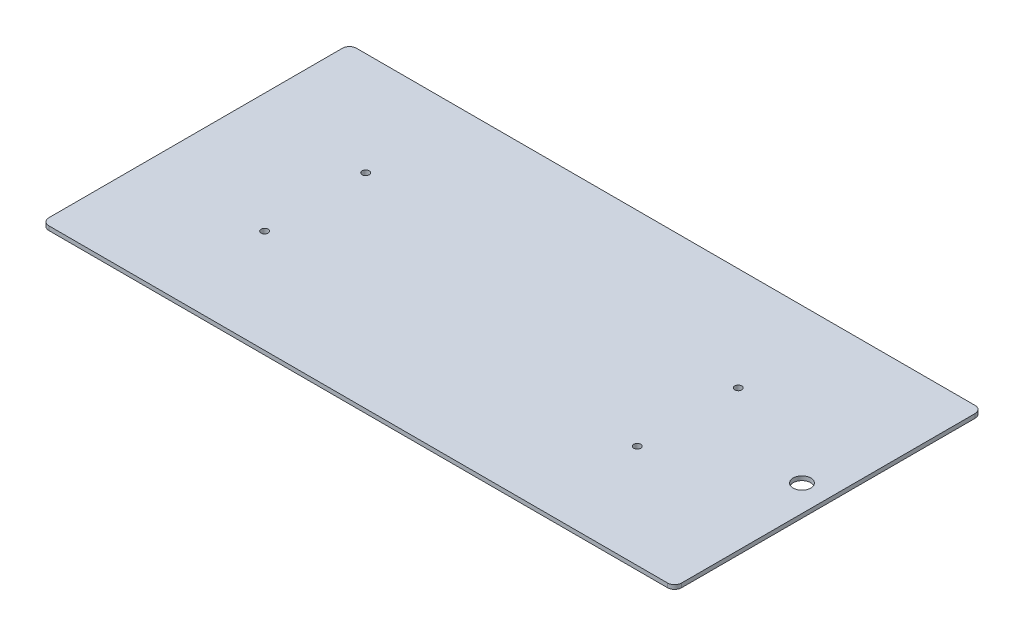
ISO-10303-21;
HEADER;
FILE_DESCRIPTION(('STEP AP214'),'2;1');
FILE_NAME('part.step','',(''),(''),'','','');
FILE_SCHEMA(('AUTOMOTIVE_DESIGN { 1 0 10303 214 1 1 1 1 }'));
ENDSEC;
DATA;
#1=APPLICATION_CONTEXT('core data for automotive mechanical design processes');
#2=APPLICATION_PROTOCOL_DEFINITION('international standard','automotive_design',2000,#1);
#3=PRODUCT_CONTEXT('',#1,'mechanical');
#4=PRODUCT('Part','Part','',(#3));
#5=PRODUCT_RELATED_PRODUCT_CATEGORY('part','',(#4));
#6=PRODUCT_DEFINITION_FORMATION('','',#4);
#7=PRODUCT_DEFINITION_CONTEXT('part definition',#1,'design');
#8=PRODUCT_DEFINITION('design','',#6,#7);
#9=PRODUCT_DEFINITION_SHAPE('','',#8);
#10=(LENGTH_UNIT() NAMED_UNIT(*) SI_UNIT(.MILLI.,.METRE.));
#11=(NAMED_UNIT(*) PLANE_ANGLE_UNIT() SI_UNIT($,.RADIAN.));
#12=(NAMED_UNIT(*) SI_UNIT($,.STERADIAN.) SOLID_ANGLE_UNIT());
#13=UNCERTAINTY_MEASURE_WITH_UNIT(LENGTH_MEASURE(1.E-05),#10,'distance_accuracy_value','');
#14=(GEOMETRIC_REPRESENTATION_CONTEXT(3) GLOBAL_UNCERTAINTY_ASSIGNED_CONTEXT((#13)) GLOBAL_UNIT_ASSIGNED_CONTEXT((#10,
#11,#12)) REPRESENTATION_CONTEXT('',''));
#15=CARTESIAN_POINT('',(0.,0.,0.));
#16=DIRECTION('',(0.,0.,1.));
#17=DIRECTION('',(1.,0.,0.));
#18=AXIS2_PLACEMENT_3D('',#15,#16,#17);
#19=CARTESIAN_POINT('',(223.52,0.,-106.045));
#20=DIRECTION('',(0.,-1.,0.));
#21=DIRECTION('',(0.,0.,-1.));
#22=AXIS2_PLACEMENT_3D('',#19,#20,#21);
#23=PLANE('',#22);
#24=CARTESIAN_POINT('',(-142.24,0.,-36.5125));
#25=DIRECTION('',(0.,-1.,0.));
#26=DIRECTION('',(0.,0.,-1.));
#27=AXIS2_PLACEMENT_3D('',#24,#25,#26);
#28=CIRCLE('',#27,6.09599999999999);
#29=CARTESIAN_POINT('',(-142.24,0.,-42.6085));
#30=VERTEX_POINT('',#29);
#31=EDGE_CURVE('E226',#30,#30,#28,.T.);
#32=ORIENTED_EDGE('',*,*,#31,.F.);
#33=EDGE_LOOP('',(#32));
#34=FACE_BOUND('',#33,.T.);
#35=CARTESIAN_POINT('',(127.,0.,36.5125));
#36=DIRECTION('',(0.,-1.,0.));
#37=DIRECTION('',(0.,0.,-1.));
#38=AXIS2_PLACEMENT_3D('',#35,#36,#37);
#39=CIRCLE('',#38,6.09599999999999);
#40=CARTESIAN_POINT('',(127.,0.,30.4165));
#41=VERTEX_POINT('',#40);
#42=EDGE_CURVE('E207',#41,#41,#39,.T.);
#43=ORIENTED_EDGE('',*,*,#42,.F.);
#44=EDGE_LOOP('',(#43));
#45=FACE_BOUND('',#44,.T.);
#46=CARTESIAN_POINT('',(223.52,0.,-106.045));
#47=DIRECTION('',(0.,1.,0.));
#48=DIRECTION('',(0.,0.,-1.));
#49=AXIS2_PLACEMENT_3D('',#46,#47,#48);
#50=CIRCLE('',#49,5.08);
#51=CARTESIAN_POINT('',(228.6,0.,-106.045));
#52=VERTEX_POINT('',#51);
#53=CARTESIAN_POINT('',(223.52,0.,-111.125));
#54=VERTEX_POINT('',#53);
#55=EDGE_CURVE('E139',#52,#54,#50,.T.);
#56=ORIENTED_EDGE('',*,*,#55,.F.);
#57=DIRECTION('',(0.,0.,-1.));
#58=VECTOR('',#57,1.);
#59=CARTESIAN_POINT('',(228.6,0.,106.045));
#60=LINE('',#59,#58);
#61=CARTESIAN_POINT('',(228.6,0.,106.045));
#62=VERTEX_POINT('',#61);
#63=EDGE_CURVE('E91',#62,#52,#60,.T.);
#64=ORIENTED_EDGE('',*,*,#63,.F.);
#65=CARTESIAN_POINT('',(223.52,0.,106.045));
#66=DIRECTION('',(0.,1.,0.));
#67=DIRECTION('',(0.,0.,1.));
#68=AXIS2_PLACEMENT_3D('',#65,#66,#67);
#69=CIRCLE('',#68,5.08);
#70=CARTESIAN_POINT('',(223.52,0.,111.125));
#71=VERTEX_POINT('',#70);
#72=EDGE_CURVE('E85',#71,#62,#69,.T.);
#73=ORIENTED_EDGE('',*,*,#72,.F.);
#74=DIRECTION('',(1.,0.,0.));
#75=VECTOR('',#74,1.);
#76=CARTESIAN_POINT('',(-223.52,0.,111.125));
#77=LINE('',#76,#75);
#78=CARTESIAN_POINT('',(-223.52,0.,111.125));
#79=VERTEX_POINT('',#78);
#80=EDGE_CURVE('E128',#79,#71,#77,.T.);
#81=ORIENTED_EDGE('',*,*,#80,.F.);
#82=CARTESIAN_POINT('',(-223.52,0.,106.045));
#83=DIRECTION('',(0.,1.,0.));
#84=DIRECTION('',(0.,0.,-1.));
#85=AXIS2_PLACEMENT_3D('',#82,#83,#84);
#86=CIRCLE('',#85,5.08);
#87=CARTESIAN_POINT('',(-228.6,0.,106.045));
#88=VERTEX_POINT('',#87);
#89=EDGE_CURVE('E149',#88,#79,#86,.T.);
#90=ORIENTED_EDGE('',*,*,#89,.F.);
#91=DIRECTION('',(0.,0.,1.));
#92=VECTOR('',#91,1.);
#93=CARTESIAN_POINT('',(-228.6,0.,106.045));
#94=LINE('',#93,#92);
#95=CARTESIAN_POINT('',(-228.6,0.,-106.045));
#96=VERTEX_POINT('',#95);
#97=EDGE_CURVE('E147',#96,#88,#94,.T.);
#98=ORIENTED_EDGE('',*,*,#97,.F.);
#99=CARTESIAN_POINT('',(-223.52,0.,-106.045));
#100=DIRECTION('',(0.,1.,0.));
#101=DIRECTION('',(0.,0.,-1.));
#102=AXIS2_PLACEMENT_3D('',#99,#100,#101);
#103=CIRCLE('',#102,5.08);
#104=CARTESIAN_POINT('',(-223.52,0.,-111.125));
#105=VERTEX_POINT('',#104);
#106=EDGE_CURVE('E145',#105,#96,#103,.T.);
#107=ORIENTED_EDGE('',*,*,#106,.F.);
#108=DIRECTION('',(-1.,0.,0.));
#109=VECTOR('',#108,1.);
#110=CARTESIAN_POINT('',(-223.52,0.,-111.125));
#111=LINE('',#110,#109);
#112=EDGE_CURVE('E142',#54,#105,#111,.T.);
#113=ORIENTED_EDGE('',*,*,#112,.F.);
#114=EDGE_LOOP('',(#56,#64,#73,#81,#90,#98,#107,#113));
#115=FACE_BOUND('',#114,.T.);
#116=CARTESIAN_POINT('',(209.55,0.,0.));
#117=DIRECTION('',(0.,1.,0.));
#118=DIRECTION('',(0.,0.,1.));
#119=AXIS2_PLACEMENT_3D('',#116,#117,#118);
#120=CIRCLE('',#119,6.35);
#121=CARTESIAN_POINT('',(209.55,0.,6.35));
#122=VERTEX_POINT('',#121);
#123=EDGE_CURVE('E201',#122,#122,#120,.T.);
#124=ORIENTED_EDGE('',*,*,#123,.T.);
#125=EDGE_LOOP('',(#124));
#126=FACE_BOUND('',#125,.T.);
#127=CARTESIAN_POINT('',(127.,0.,-36.5125));
#128=DIRECTION('',(0.,-1.,0.));
#129=DIRECTION('',(0.,0.,-1.));
#130=AXIS2_PLACEMENT_3D('',#127,#128,#129);
#131=CIRCLE('',#130,6.09599999999999);
#132=CARTESIAN_POINT('',(127.,0.,-42.6085));
#133=VERTEX_POINT('',#132);
#134=EDGE_CURVE('E217',#133,#133,#131,.T.);
#135=ORIENTED_EDGE('',*,*,#134,.F.);
#136=EDGE_LOOP('',(#135));
#137=FACE_BOUND('',#136,.T.);
#138=CARTESIAN_POINT('',(-142.24,0.,36.5125));
#139=DIRECTION('',(0.,-1.,0.));
#140=DIRECTION('',(0.,0.,-1.));
#141=AXIS2_PLACEMENT_3D('',#138,#139,#140);
#142=CIRCLE('',#141,6.09599999999999);
#143=CARTESIAN_POINT('',(-142.24,0.,30.4165));
#144=VERTEX_POINT('',#143);
#145=EDGE_CURVE('E235',#144,#144,#142,.T.);
#146=ORIENTED_EDGE('',*,*,#145,.F.);
#147=EDGE_LOOP('',(#146));
#148=FACE_BOUND('',#147,.T.);
#149=ADVANCED_FACE('F39',(#34,#45,#115,#126,#137,#148),#23,.T.);
#150=CARTESIAN_POINT('',(223.52,3.,-106.045));
#151=DIRECTION('',(0.,-1.,0.));
#152=DIRECTION('',(0.,0.,-1.));
#153=AXIS2_PLACEMENT_3D('',#150,#151,#152);
#154=PLANE('',#153);
#155=CARTESIAN_POINT('',(223.52,3.,-106.045));
#156=DIRECTION('',(0.,1.,0.));
#157=DIRECTION('',(0.,0.,-1.));
#158=AXIS2_PLACEMENT_3D('',#155,#156,#157);
#159=CIRCLE('',#158,5.08);
#160=CARTESIAN_POINT('',(228.6,3.,-106.045));
#161=VERTEX_POINT('',#160);
#162=CARTESIAN_POINT('',(223.52,3.,-111.125));
#163=VERTEX_POINT('',#162);
#164=EDGE_CURVE('E154',#161,#163,#159,.T.);
#165=ORIENTED_EDGE('',*,*,#164,.T.);
#166=DIRECTION('',(-1.,0.,0.));
#167=VECTOR('',#166,1.);
#168=CARTESIAN_POINT('',(-223.52,3.,-111.125));
#169=LINE('',#168,#167);
#170=CARTESIAN_POINT('',(-223.52,3.,-111.125));
#171=VERTEX_POINT('',#170);
#172=EDGE_CURVE('E99',#163,#171,#169,.T.);
#173=ORIENTED_EDGE('',*,*,#172,.T.);
#174=CARTESIAN_POINT('',(-223.52,3.,-106.045));
#175=DIRECTION('',(0.,1.,0.));
#176=DIRECTION('',(0.,0.,-1.));
#177=AXIS2_PLACEMENT_3D('',#174,#175,#176);
#178=CIRCLE('',#177,5.08);
#179=CARTESIAN_POINT('',(-228.6,3.,-106.045));
#180=VERTEX_POINT('',#179);
#181=EDGE_CURVE('E169',#171,#180,#178,.T.);
#182=ORIENTED_EDGE('',*,*,#181,.T.);
#183=DIRECTION('',(0.,0.,1.));
#184=VECTOR('',#183,1.);
#185=CARTESIAN_POINT('',(-228.6,3.,106.045));
#186=LINE('',#185,#184);
#187=CARTESIAN_POINT('',(-228.6,3.,106.045));
#188=VERTEX_POINT('',#187);
#189=EDGE_CURVE('E181',#180,#188,#186,.T.);
#190=ORIENTED_EDGE('',*,*,#189,.T.);
#191=CARTESIAN_POINT('',(-223.52,3.,106.045));
#192=DIRECTION('',(0.,1.,0.));
#193=DIRECTION('',(0.,0.,-1.));
#194=AXIS2_PLACEMENT_3D('',#191,#192,#193);
#195=CIRCLE('',#194,5.08);
#196=CARTESIAN_POINT('',(-223.52,3.,111.125));
#197=VERTEX_POINT('',#196);
#198=EDGE_CURVE('E119',#188,#197,#195,.T.);
#199=ORIENTED_EDGE('',*,*,#198,.T.);
#200=DIRECTION('',(1.,0.,0.));
#201=VECTOR('',#200,1.);
#202=CARTESIAN_POINT('',(-223.52,3.,111.125));
#203=LINE('',#202,#201);
#204=CARTESIAN_POINT('',(223.52,3.,111.125));
#205=VERTEX_POINT('',#204);
#206=EDGE_CURVE('E112',#197,#205,#203,.T.);
#207=ORIENTED_EDGE('',*,*,#206,.T.);
#208=CARTESIAN_POINT('',(223.52,3.,106.045));
#209=DIRECTION('',(0.,1.,0.));
#210=DIRECTION('',(0.,0.,1.));
#211=AXIS2_PLACEMENT_3D('',#208,#209,#210);
#212=CIRCLE('',#211,5.08);
#213=CARTESIAN_POINT('',(228.6,3.,106.045));
#214=VERTEX_POINT('',#213);
#215=EDGE_CURVE('E117',#205,#214,#212,.T.);
#216=ORIENTED_EDGE('',*,*,#215,.T.);
#217=DIRECTION('',(0.,0.,-1.));
#218=VECTOR('',#217,1.);
#219=CARTESIAN_POINT('',(228.6,3.,106.045));
#220=LINE('',#219,#218);
#221=EDGE_CURVE('E56',#214,#161,#220,.T.);
#222=ORIENTED_EDGE('',*,*,#221,.T.);
#223=EDGE_LOOP('',(#165,#173,#182,#190,#199,#207,#216,#222));
#224=FACE_BOUND('',#223,.T.);
#225=CARTESIAN_POINT('',(127.,3.,36.5125));
#226=DIRECTION('',(0.,1.,0.));
#227=DIRECTION('',(0.,0.,1.));
#228=AXIS2_PLACEMENT_3D('',#225,#226,#227);
#229=CIRCLE('',#228,2.53999999999998);
#230=CARTESIAN_POINT('',(127.,3.,39.0525));
#231=VERTEX_POINT('',#230);
#232=EDGE_CURVE('E143',#231,#231,#229,.T.);
#233=ORIENTED_EDGE('',*,*,#232,.F.);
#234=EDGE_LOOP('',(#233));
#235=FACE_BOUND('',#234,.T.);
#236=CARTESIAN_POINT('',(127.,3.,-36.5125));
#237=DIRECTION('',(0.,1.,0.));
#238=DIRECTION('',(0.,0.,1.));
#239=AXIS2_PLACEMENT_3D('',#236,#237,#238);
#240=CIRCLE('',#239,2.53999999999998);
#241=CARTESIAN_POINT('',(127.,3.,-33.9725));
#242=VERTEX_POINT('',#241);
#243=EDGE_CURVE('E189',#242,#242,#240,.T.);
#244=ORIENTED_EDGE('',*,*,#243,.F.);
#245=EDGE_LOOP('',(#244));
#246=FACE_BOUND('',#245,.T.);
#247=CARTESIAN_POINT('',(-142.24,3.,-36.5125));
#248=DIRECTION('',(0.,1.,0.));
#249=DIRECTION('',(0.,0.,1.));
#250=AXIS2_PLACEMENT_3D('',#247,#248,#249);
#251=CIRCLE('',#250,2.53999999999998);
#252=CARTESIAN_POINT('',(-142.24,3.,-33.9725));
#253=VERTEX_POINT('',#252);
#254=EDGE_CURVE('E193',#253,#253,#251,.T.);
#255=ORIENTED_EDGE('',*,*,#254,.F.);
#256=EDGE_LOOP('',(#255));
#257=FACE_BOUND('',#256,.T.);
#258=CARTESIAN_POINT('',(-142.24,3.,36.5125));
#259=DIRECTION('',(0.,1.,0.));
#260=DIRECTION('',(0.,0.,1.));
#261=AXIS2_PLACEMENT_3D('',#258,#259,#260);
#262=CIRCLE('',#261,2.53999999999998);
#263=CARTESIAN_POINT('',(-142.24,3.,39.0525));
#264=VERTEX_POINT('',#263);
#265=EDGE_CURVE('E197',#264,#264,#262,.T.);
#266=ORIENTED_EDGE('',*,*,#265,.F.);
#267=EDGE_LOOP('',(#266));
#268=FACE_BOUND('',#267,.T.);
#269=CARTESIAN_POINT('',(209.55,3.,0.));
#270=DIRECTION('',(0.,1.,0.));
#271=DIRECTION('',(0.,0.,1.));
#272=AXIS2_PLACEMENT_3D('',#269,#270,#271);
#273=CIRCLE('',#272,6.35);
#274=CARTESIAN_POINT('',(209.55,3.,6.35));
#275=VERTEX_POINT('',#274);
#276=EDGE_CURVE('E200',#275,#275,#273,.T.);
#277=ORIENTED_EDGE('',*,*,#276,.F.);
#278=EDGE_LOOP('',(#277));
#279=FACE_BOUND('',#278,.T.);
#280=ADVANCED_FACE('F114',(#224,#235,#246,#257,#268,#279),#154,.F.);
#281=CARTESIAN_POINT('',(223.52,3.,-106.045));
#282=DIRECTION('',(0.,-1.,0.));
#283=DIRECTION('',(0.,0.,-1.));
#284=AXIS2_PLACEMENT_3D('',#281,#282,#283);
#285=CYLINDRICAL_SURFACE('',#284,5.08);
#286=ORIENTED_EDGE('',*,*,#55,.T.);
#287=DIRECTION('',(0.,-1.,0.));
#288=VECTOR('',#287,1.);
#289=CARTESIAN_POINT('',(223.52,3.,-111.125));
#290=LINE('',#289,#288);
#291=EDGE_CURVE('E11',#163,#54,#290,.T.);
#292=ORIENTED_EDGE('',*,*,#291,.F.);
#293=ORIENTED_EDGE('',*,*,#164,.F.);
#294=DIRECTION('',(0.,-1.,0.));
#295=VECTOR('',#294,1.);
#296=CARTESIAN_POINT('',(228.6,3.,-106.045));
#297=LINE('',#296,#295);
#298=EDGE_CURVE('E135',#161,#52,#297,.T.);
#299=ORIENTED_EDGE('',*,*,#298,.T.);
#300=EDGE_LOOP('',(#286,#292,#293,#299));
#301=FACE_BOUND('',#300,.T.);
#302=ADVANCED_FACE('F41',(#301),#285,.T.);
#303=CARTESIAN_POINT('',(-223.52,3.,-111.125));
#304=DIRECTION('',(0.,0.,1.));
#305=DIRECTION('',(1.,0.,0.));
#306=AXIS2_PLACEMENT_3D('',#303,#304,#305);
#307=PLANE('',#306);
#308=ORIENTED_EDGE('',*,*,#112,.T.);
#309=DIRECTION('',(0.,-1.,0.));
#310=VECTOR('',#309,1.);
#311=CARTESIAN_POINT('',(-223.52,3.,-111.125));
#312=LINE('',#311,#310);
#313=EDGE_CURVE('E48',#171,#105,#312,.T.);
#314=ORIENTED_EDGE('',*,*,#313,.F.);
#315=ORIENTED_EDGE('',*,*,#172,.F.);
#316=ORIENTED_EDGE('',*,*,#291,.T.);
#317=EDGE_LOOP('',(#308,#314,#315,#316));
#318=FACE_BOUND('',#317,.T.);
#319=ADVANCED_FACE('F286',(#318),#307,.F.);
#320=CARTESIAN_POINT('',(-223.52,3.,-106.045));
#321=DIRECTION('',(0.,-1.,0.));
#322=DIRECTION('',(0.,0.,-1.));
#323=AXIS2_PLACEMENT_3D('',#320,#321,#322);
#324=CYLINDRICAL_SURFACE('',#323,5.08);
#325=ORIENTED_EDGE('',*,*,#106,.T.);
#326=DIRECTION('',(0.,-1.,0.));
#327=VECTOR('',#326,1.);
#328=CARTESIAN_POINT('',(-228.6,3.,-106.045));
#329=LINE('',#328,#327);
#330=EDGE_CURVE('E161',#180,#96,#329,.T.);
#331=ORIENTED_EDGE('',*,*,#330,.F.);
#332=ORIENTED_EDGE('',*,*,#181,.F.);
#333=ORIENTED_EDGE('',*,*,#313,.T.);
#334=EDGE_LOOP('',(#325,#331,#332,#333));
#335=FACE_BOUND('',#334,.T.);
#336=ADVANCED_FACE('F167',(#335),#324,.T.);
#337=CARTESIAN_POINT('',(-228.6,3.,106.045));
#338=DIRECTION('',(1.,0.,0.));
#339=DIRECTION('',(0.,0.,-1.));
#340=AXIS2_PLACEMENT_3D('',#337,#338,#339);
#341=PLANE('',#340);
#342=ORIENTED_EDGE('',*,*,#97,.T.);
#343=DIRECTION('',(0.,-1.,0.));
#344=VECTOR('',#343,1.);
#345=CARTESIAN_POINT('',(-228.6,3.,106.045));
#346=LINE('',#345,#344);
#347=EDGE_CURVE('E158',#188,#88,#346,.T.);
#348=ORIENTED_EDGE('',*,*,#347,.F.);
#349=ORIENTED_EDGE('',*,*,#189,.F.);
#350=ORIENTED_EDGE('',*,*,#330,.T.);
#351=EDGE_LOOP('',(#342,#348,#349,#350));
#352=FACE_BOUND('',#351,.T.);
#353=ADVANCED_FACE('F177',(#352),#341,.F.);
#354=CARTESIAN_POINT('',(-223.52,3.,106.045));
#355=DIRECTION('',(0.,-1.,0.));
#356=DIRECTION('',(0.,0.,-1.));
#357=AXIS2_PLACEMENT_3D('',#354,#355,#356);
#358=CYLINDRICAL_SURFACE('',#357,5.08);
#359=ORIENTED_EDGE('',*,*,#89,.T.);
#360=DIRECTION('',(0.,-1.,0.));
#361=VECTOR('',#360,1.);
#362=CARTESIAN_POINT('',(-223.52,3.,111.125));
#363=LINE('',#362,#361);
#364=EDGE_CURVE('E129',#197,#79,#363,.T.);
#365=ORIENTED_EDGE('',*,*,#364,.F.);
#366=ORIENTED_EDGE('',*,*,#198,.F.);
#367=ORIENTED_EDGE('',*,*,#347,.T.);
#368=EDGE_LOOP('',(#359,#365,#366,#367));
#369=FACE_BOUND('',#368,.T.);
#370=ADVANCED_FACE('F180',(#369),#358,.T.);
#371=CARTESIAN_POINT('',(-223.52,3.,111.125));
#372=DIRECTION('',(0.,0.,-1.));
#373=DIRECTION('',(-1.,0.,0.));
#374=AXIS2_PLACEMENT_3D('',#371,#372,#373);
#375=PLANE('',#374);
#376=ORIENTED_EDGE('',*,*,#80,.T.);
#377=DIRECTION('',(0.,-1.,0.));
#378=VECTOR('',#377,1.);
#379=CARTESIAN_POINT('',(223.52,3.,111.125));
#380=LINE('',#379,#378);
#381=EDGE_CURVE('E125',#205,#71,#380,.T.);
#382=ORIENTED_EDGE('',*,*,#381,.F.);
#383=ORIENTED_EDGE('',*,*,#206,.F.);
#384=ORIENTED_EDGE('',*,*,#364,.T.);
#385=EDGE_LOOP('',(#376,#382,#383,#384));
#386=FACE_BOUND('',#385,.T.);
#387=ADVANCED_FACE('F126',(#386),#375,.F.);
#388=CARTESIAN_POINT('',(223.52,3.,106.045));
#389=DIRECTION('',(0.,-1.,0.));
#390=DIRECTION('',(0.,0.,-1.));
#391=AXIS2_PLACEMENT_3D('',#388,#389,#390);
#392=CYLINDRICAL_SURFACE('',#391,5.08);
#393=ORIENTED_EDGE('',*,*,#72,.T.);
#394=DIRECTION('',(0.,-1.,0.));
#395=VECTOR('',#394,1.);
#396=CARTESIAN_POINT('',(228.6,3.,106.045));
#397=LINE('',#396,#395);
#398=EDGE_CURVE('E130',#214,#62,#397,.T.);
#399=ORIENTED_EDGE('',*,*,#398,.F.);
#400=ORIENTED_EDGE('',*,*,#215,.F.);
#401=ORIENTED_EDGE('',*,*,#381,.T.);
#402=EDGE_LOOP('',(#393,#399,#400,#401));
#403=FACE_BOUND('',#402,.T.);
#404=ADVANCED_FACE('F132',(#403),#392,.T.);
#405=CARTESIAN_POINT('',(228.6,3.,106.045));
#406=DIRECTION('',(-1.,0.,0.));
#407=DIRECTION('',(0.,0.,1.));
#408=AXIS2_PLACEMENT_3D('',#405,#406,#407);
#409=PLANE('',#408);
#410=ORIENTED_EDGE('',*,*,#63,.T.);
#411=ORIENTED_EDGE('',*,*,#298,.F.);
#412=ORIENTED_EDGE('',*,*,#221,.F.);
#413=ORIENTED_EDGE('',*,*,#398,.T.);
#414=EDGE_LOOP('',(#410,#411,#412,#413));
#415=FACE_BOUND('',#414,.T.);
#416=ADVANCED_FACE('F273',(#415),#409,.F.);
#417=CARTESIAN_POINT('',(127.,3.,36.5125));
#418=DIRECTION('',(0.,-1.,0.));
#419=DIRECTION('',(0.,0.,-1.));
#420=AXIS2_PLACEMENT_3D('',#417,#418,#419);
#421=CYLINDRICAL_SURFACE('',#420,2.53999999999998);
#422=ORIENTED_EDGE('',*,*,#232,.T.);
#423=EDGE_LOOP('',(#422));
#424=FACE_BOUND('',#423,.T.);
#425=CARTESIAN_POINT('',(127.,-10.16,36.5125));
#426=DIRECTION('',(0.,-1.,0.));
#427=DIRECTION('',(0.,0.,-1.));
#428=AXIS2_PLACEMENT_3D('',#425,#426,#427);
#429=CIRCLE('',#428,2.53999999999998);
#430=CARTESIAN_POINT('',(127.,-10.16,33.9725));
#431=VERTEX_POINT('',#430);
#432=EDGE_CURVE('E210',#431,#431,#429,.T.);
#433=ORIENTED_EDGE('',*,*,#432,.T.);
#434=EDGE_LOOP('',(#433));
#435=FACE_BOUND('',#434,.T.);
#436=ADVANCED_FACE('F276',(#424,#435),#421,.F.);
#437=CARTESIAN_POINT('',(127.,3.,-36.5125));
#438=DIRECTION('',(0.,-1.,0.));
#439=DIRECTION('',(0.,0.,-1.));
#440=AXIS2_PLACEMENT_3D('',#437,#438,#439);
#441=CYLINDRICAL_SURFACE('',#440,2.53999999999998);
#442=ORIENTED_EDGE('',*,*,#243,.T.);
#443=EDGE_LOOP('',(#442));
#444=FACE_BOUND('',#443,.T.);
#445=CARTESIAN_POINT('',(127.,-10.16,-36.5125));
#446=DIRECTION('',(0.,-1.,0.));
#447=DIRECTION('',(0.,0.,-1.));
#448=AXIS2_PLACEMENT_3D('',#445,#446,#447);
#449=CIRCLE('',#448,2.53999999999998);
#450=CARTESIAN_POINT('',(127.,-10.16,-39.0525));
#451=VERTEX_POINT('',#450);
#452=EDGE_CURVE('E220',#451,#451,#449,.T.);
#453=ORIENTED_EDGE('',*,*,#452,.T.);
#454=EDGE_LOOP('',(#453));
#455=FACE_BOUND('',#454,.T.);
#456=ADVANCED_FACE('F315',(#444,#455),#441,.F.);
#457=CARTESIAN_POINT('',(-142.24,3.,-36.5125));
#458=DIRECTION('',(0.,-1.,0.));
#459=DIRECTION('',(0.,0.,-1.));
#460=AXIS2_PLACEMENT_3D('',#457,#458,#459);
#461=CYLINDRICAL_SURFACE('',#460,2.53999999999998);
#462=ORIENTED_EDGE('',*,*,#254,.T.);
#463=EDGE_LOOP('',(#462));
#464=FACE_BOUND('',#463,.T.);
#465=CARTESIAN_POINT('',(-142.24,-10.16,-36.5125));
#466=DIRECTION('',(0.,-1.,0.));
#467=DIRECTION('',(0.,0.,-1.));
#468=AXIS2_PLACEMENT_3D('',#465,#466,#467);
#469=CIRCLE('',#468,2.53999999999998);
#470=CARTESIAN_POINT('',(-142.24,-10.16,-39.0525));
#471=VERTEX_POINT('',#470);
#472=EDGE_CURVE('E229',#471,#471,#469,.T.);
#473=ORIENTED_EDGE('',*,*,#472,.T.);
#474=EDGE_LOOP('',(#473));
#475=FACE_BOUND('',#474,.T.);
#476=ADVANCED_FACE('F325',(#464,#475),#461,.F.);
#477=CARTESIAN_POINT('',(-142.24,3.,36.5125));
#478=DIRECTION('',(0.,-1.,0.));
#479=DIRECTION('',(0.,0.,-1.));
#480=AXIS2_PLACEMENT_3D('',#477,#478,#479);
#481=CYLINDRICAL_SURFACE('',#480,2.53999999999998);
#482=ORIENTED_EDGE('',*,*,#265,.T.);
#483=EDGE_LOOP('',(#482));
#484=FACE_BOUND('',#483,.T.);
#485=CARTESIAN_POINT('',(-142.24,-10.16,36.5125));
#486=DIRECTION('',(0.,-1.,0.));
#487=DIRECTION('',(0.,0.,-1.));
#488=AXIS2_PLACEMENT_3D('',#485,#486,#487);
#489=CIRCLE('',#488,2.53999999999998);
#490=CARTESIAN_POINT('',(-142.24,-10.16,33.9725));
#491=VERTEX_POINT('',#490);
#492=EDGE_CURVE('E238',#491,#491,#489,.T.);
#493=ORIENTED_EDGE('',*,*,#492,.T.);
#494=EDGE_LOOP('',(#493));
#495=FACE_BOUND('',#494,.T.);
#496=ADVANCED_FACE('F245',(#484,#495),#481,.F.);
#497=CARTESIAN_POINT('',(209.55,3.,0.));
#498=DIRECTION('',(0.,-1.,0.));
#499=DIRECTION('',(0.,0.,-1.));
#500=AXIS2_PLACEMENT_3D('',#497,#498,#499);
#501=CYLINDRICAL_SURFACE('',#500,6.35);
#502=ORIENTED_EDGE('',*,*,#276,.T.);
#503=EDGE_LOOP('',(#502));
#504=FACE_BOUND('',#503,.T.);
#505=ORIENTED_EDGE('',*,*,#123,.F.);
#506=EDGE_LOOP('',(#505));
#507=FACE_BOUND('',#506,.T.);
#508=ADVANCED_FACE('F348',(#504,#507),#501,.F.);
#509=CARTESIAN_POINT('',(127.,-10.16,36.5125));
#510=DIRECTION('',(0.,-1.,0.));
#511=DIRECTION('',(0.,0.,-1.));
#512=AXIS2_PLACEMENT_3D('',#509,#510,#511);
#513=PLANE('',#512);
#514=CARTESIAN_POINT('',(127.,-10.16,36.5125));
#515=DIRECTION('',(0.,-1.,0.));
#516=DIRECTION('',(0.,0.,-1.));
#517=AXIS2_PLACEMENT_3D('',#514,#515,#516);
#518=CIRCLE('',#517,6.09599999999999);
#519=CARTESIAN_POINT('',(127.,-10.16,30.4165));
#520=VERTEX_POINT('',#519);
#521=EDGE_CURVE('E204',#520,#520,#518,.T.);
#522=ORIENTED_EDGE('',*,*,#521,.T.);
#523=EDGE_LOOP('',(#522));
#524=FACE_BOUND('',#523,.T.);
#525=ORIENTED_EDGE('',*,*,#432,.F.);
#526=EDGE_LOOP('',(#525));
#527=FACE_BOUND('',#526,.T.);
#528=ADVANCED_FACE('F343',(#524,#527),#513,.T.);
#529=CARTESIAN_POINT('',(127.,-10.16,36.5125));
#530=DIRECTION('',(0.,1.,0.));
#531=DIRECTION('',(0.,0.,1.));
#532=AXIS2_PLACEMENT_3D('',#529,#530,#531);
#533=CYLINDRICAL_SURFACE('',#532,6.09599999999999);
#534=ORIENTED_EDGE('',*,*,#521,.F.);
#535=EDGE_LOOP('',(#534));
#536=FACE_BOUND('',#535,.T.);
#537=ORIENTED_EDGE('',*,*,#42,.T.);
#538=EDGE_LOOP('',(#537));
#539=FACE_BOUND('',#538,.T.);
#540=ADVANCED_FACE('F347',(#536,#539),#533,.T.);
#541=CARTESIAN_POINT('',(127.,-10.16,-36.5125));
#542=DIRECTION('',(0.,-1.,0.));
#543=DIRECTION('',(0.,0.,-1.));
#544=AXIS2_PLACEMENT_3D('',#541,#542,#543);
#545=PLANE('',#544);
#546=CARTESIAN_POINT('',(127.,-10.16,-36.5125));
#547=DIRECTION('',(0.,-1.,0.));
#548=DIRECTION('',(0.,0.,-1.));
#549=AXIS2_PLACEMENT_3D('',#546,#547,#548);
#550=CIRCLE('',#549,6.09599999999999);
#551=CARTESIAN_POINT('',(127.,-10.16,-42.6085));
#552=VERTEX_POINT('',#551);
#553=EDGE_CURVE('E216',#552,#552,#550,.T.);
#554=ORIENTED_EDGE('',*,*,#553,.T.);
#555=EDGE_LOOP('',(#554));
#556=FACE_BOUND('',#555,.T.);
#557=ORIENTED_EDGE('',*,*,#452,.F.);
#558=EDGE_LOOP('',(#557));
#559=FACE_BOUND('',#558,.T.);
#560=ADVANCED_FACE('F438',(#556,#559),#545,.T.);
#561=CARTESIAN_POINT('',(127.,-10.16,-36.5125));
#562=DIRECTION('',(0.,1.,0.));
#563=DIRECTION('',(0.,0.,1.));
#564=AXIS2_PLACEMENT_3D('',#561,#562,#563);
#565=CYLINDRICAL_SURFACE('',#564,6.09599999999999);
#566=ORIENTED_EDGE('',*,*,#553,.F.);
#567=EDGE_LOOP('',(#566));
#568=FACE_BOUND('',#567,.T.);
#569=ORIENTED_EDGE('',*,*,#134,.T.);
#570=EDGE_LOOP('',(#569));
#571=FACE_BOUND('',#570,.T.);
#572=ADVANCED_FACE('F441',(#568,#571),#565,.T.);
#573=CARTESIAN_POINT('',(-142.24,-10.16,-36.5125));
#574=DIRECTION('',(0.,-1.,0.));
#575=DIRECTION('',(0.,0.,-1.));
#576=AXIS2_PLACEMENT_3D('',#573,#574,#575);
#577=PLANE('',#576);
#578=CARTESIAN_POINT('',(-142.24,-10.16,-36.5125));
#579=DIRECTION('',(0.,-1.,0.));
#580=DIRECTION('',(0.,0.,-1.));
#581=AXIS2_PLACEMENT_3D('',#578,#579,#580);
#582=CIRCLE('',#581,6.09599999999999);
#583=CARTESIAN_POINT('',(-142.24,-10.16,-42.6085));
#584=VERTEX_POINT('',#583);
#585=EDGE_CURVE('E225',#584,#584,#582,.T.);
#586=ORIENTED_EDGE('',*,*,#585,.T.);
#587=EDGE_LOOP('',(#586));
#588=FACE_BOUND('',#587,.T.);
#589=ORIENTED_EDGE('',*,*,#472,.F.);
#590=EDGE_LOOP('',(#589));
#591=FACE_BOUND('',#590,.T.);
#592=ADVANCED_FACE('F259',(#588,#591),#577,.T.);
#593=CARTESIAN_POINT('',(-142.24,-10.16,-36.5125));
#594=DIRECTION('',(0.,1.,0.));
#595=DIRECTION('',(0.,0.,1.));
#596=AXIS2_PLACEMENT_3D('',#593,#594,#595);
#597=CYLINDRICAL_SURFACE('',#596,6.09599999999999);
#598=ORIENTED_EDGE('',*,*,#585,.F.);
#599=EDGE_LOOP('',(#598));
#600=FACE_BOUND('',#599,.T.);
#601=ORIENTED_EDGE('',*,*,#31,.T.);
#602=EDGE_LOOP('',(#601));
#603=FACE_BOUND('',#602,.T.);
#604=ADVANCED_FACE('F250',(#600,#603),#597,.T.);
#605=CARTESIAN_POINT('',(-142.24,-10.16,36.5125));
#606=DIRECTION('',(0.,-1.,0.));
#607=DIRECTION('',(0.,0.,-1.));
#608=AXIS2_PLACEMENT_3D('',#605,#606,#607);
#609=PLANE('',#608);
#610=CARTESIAN_POINT('',(-142.24,-10.16,36.5125));
#611=DIRECTION('',(0.,-1.,0.));
#612=DIRECTION('',(0.,0.,-1.));
#613=AXIS2_PLACEMENT_3D('',#610,#611,#612);
#614=CIRCLE('',#613,6.09599999999999);
#615=CARTESIAN_POINT('',(-142.24,-10.16,30.4165));
#616=VERTEX_POINT('',#615);
#617=EDGE_CURVE('E234',#616,#616,#614,.T.);
#618=ORIENTED_EDGE('',*,*,#617,.T.);
#619=EDGE_LOOP('',(#618));
#620=FACE_BOUND('',#619,.T.);
#621=ORIENTED_EDGE('',*,*,#492,.F.);
#622=EDGE_LOOP('',(#621));
#623=FACE_BOUND('',#622,.T.);
#624=ADVANCED_FACE('F247',(#620,#623),#609,.T.);
#625=CARTESIAN_POINT('',(-142.24,-10.16,36.5125));
#626=DIRECTION('',(0.,1.,0.));
#627=DIRECTION('',(0.,0.,1.));
#628=AXIS2_PLACEMENT_3D('',#625,#626,#627);
#629=CYLINDRICAL_SURFACE('',#628,6.09599999999999);
#630=ORIENTED_EDGE('',*,*,#617,.F.);
#631=EDGE_LOOP('',(#630));
#632=FACE_BOUND('',#631,.T.);
#633=ORIENTED_EDGE('',*,*,#145,.T.);
#634=EDGE_LOOP('',(#633));
#635=FACE_BOUND('',#634,.T.);
#636=ADVANCED_FACE('F249',(#632,#635),#629,.T.);
#637=CLOSED_SHELL('',(#149,#280,#302,#319,#336,#353,#370,#387,#404,#416,#436,#456,#476,#496,
#508,#528,#540,#560,#572,#592,#604,#624,#636));
#638=MANIFOLD_SOLID_BREP('B2',#637);
#639=ADVANCED_BREP_SHAPE_REPRESENTATION('',(#18,#638),#14);
#640=SHAPE_DEFINITION_REPRESENTATION(#9,#639);
ENDSEC;
END-ISO-10303-21;
